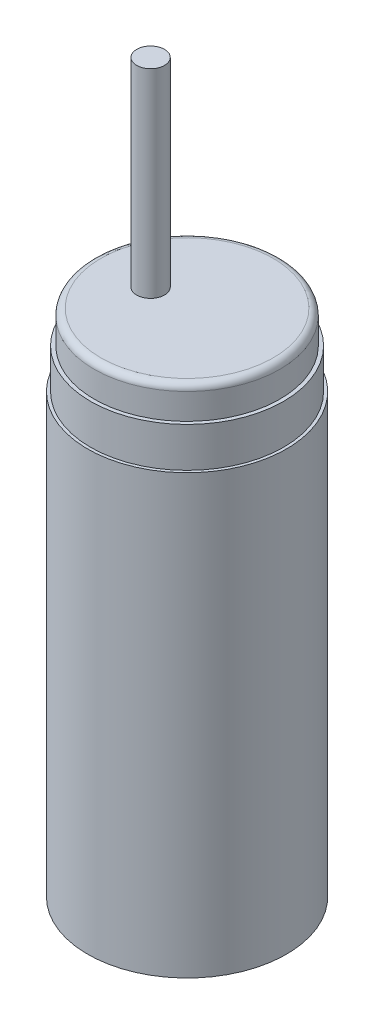
ISO-10303-21;
HEADER;
FILE_DESCRIPTION(('STEP AP214'),'2;1');
FILE_NAME('part.step','',(''),(''),'','','');
FILE_SCHEMA(('AUTOMOTIVE_DESIGN { 1 0 10303 214 1 1 1 1 }'));
ENDSEC;
DATA;
#1=APPLICATION_CONTEXT('core data for automotive mechanical design processes');
#2=APPLICATION_PROTOCOL_DEFINITION('international standard','automotive_design',2000,#1);
#3=PRODUCT_CONTEXT('',#1,'mechanical');
#4=PRODUCT('Part','Part','',(#3));
#5=PRODUCT_RELATED_PRODUCT_CATEGORY('part','',(#4));
#6=PRODUCT_DEFINITION_FORMATION('','',#4);
#7=PRODUCT_DEFINITION_CONTEXT('part definition',#1,'design');
#8=PRODUCT_DEFINITION('design','',#6,#7);
#9=PRODUCT_DEFINITION_SHAPE('','',#8);
#10=(LENGTH_UNIT() NAMED_UNIT(*) SI_UNIT(.MILLI.,.METRE.));
#11=(NAMED_UNIT(*) PLANE_ANGLE_UNIT() SI_UNIT($,.RADIAN.));
#12=(NAMED_UNIT(*) SI_UNIT($,.STERADIAN.) SOLID_ANGLE_UNIT());
#13=UNCERTAINTY_MEASURE_WITH_UNIT(LENGTH_MEASURE(1.E-05),#10,'distance_accuracy_value','');
#14=(GEOMETRIC_REPRESENTATION_CONTEXT(3) GLOBAL_UNCERTAINTY_ASSIGNED_CONTEXT((#13)) GLOBAL_UNIT_ASSIGNED_CONTEXT((#10,
#11,#12)) REPRESENTATION_CONTEXT('',''));
#15=CARTESIAN_POINT('',(0.,0.,0.));
#16=DIRECTION('',(0.,0.,1.));
#17=DIRECTION('',(1.,0.,0.));
#18=AXIS2_PLACEMENT_3D('',#15,#16,#17);
#19=CARTESIAN_POINT('',(0.,0.,0.));
#20=DIRECTION('',(0.,1.,0.));
#21=DIRECTION('',(1.,0.,0.));
#22=AXIS2_PLACEMENT_3D('',#19,#20,#21);
#23=PLANE('',#22);
#24=CARTESIAN_POINT('',(0.,0.,0.));
#25=DIRECTION('',(0.,-1.,0.));
#26=DIRECTION('',(1.,0.,0.));
#27=AXIS2_PLACEMENT_3D('',#24,#25,#26);
#28=CIRCLE('',#27,15.);
#29=CARTESIAN_POINT('',(-15.,0.,0.));
#30=VERTEX_POINT('',#29);
#31=EDGE_CURVE('E11',#30,#30,#28,.T.);
#32=ORIENTED_EDGE('',*,*,#31,.T.);
#33=EDGE_LOOP('',(#32));
#34=FACE_BOUND('',#33,.T.);
#35=CARTESIAN_POINT('',(0.,0.,0.));
#36=DIRECTION('',(0.,-1.,0.));
#37=DIRECTION('',(1.,0.,0.));
#38=AXIS2_PLACEMENT_3D('',#35,#36,#37);
#39=CIRCLE('',#38,14.);
#40=CARTESIAN_POINT('',(14.,0.,0.));
#41=VERTEX_POINT('',#40);
#42=EDGE_CURVE('E84',#41,#41,#39,.T.);
#43=ORIENTED_EDGE('',*,*,#42,.F.);
#44=EDGE_LOOP('',(#43));
#45=FACE_BOUND('',#44,.T.);
#46=ADVANCED_FACE('F17',(#34,#45),#23,.F.);
#47=CARTESIAN_POINT('',(0.,-3.6,0.));
#48=DIRECTION('',(0.,1.,0.));
#49=DIRECTION('',(1.,0.,0.));
#50=AXIS2_PLACEMENT_3D('',#47,#48,#49);
#51=CYLINDRICAL_SURFACE('',#50,15.);
#52=CARTESIAN_POINT('',(0.,66.,0.));
#53=DIRECTION('',(0.,1.,0.));
#54=DIRECTION('',(1.,0.,0.));
#55=AXIS2_PLACEMENT_3D('',#52,#53,#54);
#56=CIRCLE('',#55,15.);
#57=CARTESIAN_POINT('',(-15.,66.,0.));
#58=VERTEX_POINT('',#57);
#59=EDGE_CURVE('E28',#58,#58,#56,.T.);
#60=ORIENTED_EDGE('',*,*,#59,.F.);
#61=EDGE_LOOP('',(#60));
#62=FACE_BOUND('',#61,.T.);
#63=ORIENTED_EDGE('',*,*,#31,.F.);
#64=EDGE_LOOP('',(#63));
#65=FACE_BOUND('',#64,.T.);
#66=ADVANCED_FACE('F129',(#62,#65),#51,.T.);
#67=CARTESIAN_POINT('',(0.,66.,0.));
#68=DIRECTION('',(0.,1.,0.));
#69=DIRECTION('',(1.,0.,0.));
#70=AXIS2_PLACEMENT_3D('',#67,#68,#69);
#71=PLANE('',#70);
#72=ORIENTED_EDGE('',*,*,#59,.T.);
#73=EDGE_LOOP('',(#72));
#74=FACE_BOUND('',#73,.T.);
#75=CARTESIAN_POINT('',(0.,66.,0.));
#76=DIRECTION('',(0.,1.,0.));
#77=DIRECTION('',(1.,0.,0.));
#78=AXIS2_PLACEMENT_3D('',#75,#76,#77);
#79=CIRCLE('',#78,14.5625);
#80=CARTESIAN_POINT('',(-14.5625,66.,0.));
#81=VERTEX_POINT('',#80);
#82=EDGE_CURVE('E95',#81,#81,#79,.T.);
#83=ORIENTED_EDGE('',*,*,#82,.F.);
#84=EDGE_LOOP('',(#83));
#85=FACE_BOUND('',#84,.T.);
#86=ADVANCED_FACE('F127',(#74,#85),#71,.T.);
#87=CARTESIAN_POINT('',(0.,-3.6,0.));
#88=DIRECTION('',(0.,1.,0.));
#89=DIRECTION('',(1.,0.,0.));
#90=AXIS2_PLACEMENT_3D('',#87,#88,#89);
#91=CYLINDRICAL_SURFACE('',#90,14.5625);
#92=ORIENTED_EDGE('',*,*,#82,.T.);
#93=EDGE_LOOP('',(#92));
#94=FACE_BOUND('',#93,.T.);
#95=CARTESIAN_POINT('',(0.,72.,0.));
#96=DIRECTION('',(0.,1.,0.));
#97=DIRECTION('',(1.,0.,0.));
#98=AXIS2_PLACEMENT_3D('',#95,#96,#97);
#99=CIRCLE('',#98,14.5625);
#100=CARTESIAN_POINT('',(14.5625,72.,0.));
#101=VERTEX_POINT('',#100);
#102=EDGE_CURVE('E98',#101,#101,#99,.T.);
#103=ORIENTED_EDGE('',*,*,#102,.F.);
#104=EDGE_LOOP('',(#103));
#105=FACE_BOUND('',#104,.T.);
#106=ADVANCED_FACE('F123',(#94,#105),#91,.T.);
#107=CARTESIAN_POINT('',(0.,72.,0.));
#108=DIRECTION('',(0.,1.,0.));
#109=DIRECTION('',(1.,0.,0.));
#110=AXIS2_PLACEMENT_3D('',#107,#108,#109);
#111=PLANE('',#110);
#112=ORIENTED_EDGE('',*,*,#102,.T.);
#113=EDGE_LOOP('',(#112));
#114=FACE_BOUND('',#113,.T.);
#115=CARTESIAN_POINT('',(0.,72.,0.));
#116=DIRECTION('',(0.,1.,0.));
#117=DIRECTION('',(0.,0.,-1.));
#118=AXIS2_PLACEMENT_3D('',#115,#116,#117);
#119=CIRCLE('',#118,14.);
#120=CARTESIAN_POINT('',(0.,72.,-14.));
#121=VERTEX_POINT('',#120);
#122=EDGE_CURVE('E102',#121,#121,#119,.T.);
#123=ORIENTED_EDGE('',*,*,#122,.F.);
#124=EDGE_LOOP('',(#123));
#125=FACE_BOUND('',#124,.T.);
#126=ADVANCED_FACE('F136',(#114,#125),#111,.T.);
#127=CARTESIAN_POINT('',(0.,72.,0.));
#128=DIRECTION('',(0.,1.,0.));
#129=DIRECTION('',(0.,0.,-1.));
#130=AXIS2_PLACEMENT_3D('',#127,#128,#129);
#131=CYLINDRICAL_SURFACE('',#130,14.);
#132=CARTESIAN_POINT('',(0.,75.9,0.));
#133=DIRECTION('',(0.,1.,0.));
#134=DIRECTION('',(0.,0.,-1.));
#135=AXIS2_PLACEMENT_3D('',#132,#133,#134);
#136=CIRCLE('',#135,14.);
#137=CARTESIAN_POINT('',(0.,75.9,14.));
#138=VERTEX_POINT('',#137);
#139=EDGE_CURVE('E52',#138,#138,#136,.T.);
#140=ORIENTED_EDGE('',*,*,#139,.F.);
#141=EDGE_LOOP('',(#140));
#142=FACE_BOUND('',#141,.T.);
#143=ORIENTED_EDGE('',*,*,#122,.T.);
#144=EDGE_LOOP('',(#143));
#145=FACE_BOUND('',#144,.T.);
#146=ADVANCED_FACE('F149',(#142,#145),#131,.T.);
#147=CARTESIAN_POINT('',(0.,75.9,0.));
#148=DIRECTION('',(0.,1.,0.));
#149=DIRECTION('',(0.00972291912957834,0.,-0.999952731304635));
#150=AXIS2_PLACEMENT_3D('',#147,#148,#149);
#151=TOROIDAL_SURFACE('',#150,13.,1.);
#152=CARTESIAN_POINT('',(0.,76.9,0.));
#153=DIRECTION('',(0.,1.,0.));
#154=DIRECTION('',(0.,0.,-1.));
#155=AXIS2_PLACEMENT_3D('',#152,#153,#154);
#156=CIRCLE('',#155,13.);
#157=CARTESIAN_POINT('',(0.,76.9,13.));
#158=VERTEX_POINT('',#157);
#159=EDGE_CURVE('E64',#158,#158,#156,.T.);
#160=ORIENTED_EDGE('',*,*,#159,.F.);
#161=EDGE_LOOP('',(#160));
#162=FACE_BOUND('',#161,.T.);
#163=ORIENTED_EDGE('',*,*,#139,.T.);
#164=EDGE_LOOP('',(#163));
#165=FACE_BOUND('',#164,.T.);
#166=ADVANCED_FACE('F147',(#162,#165),#151,.T.);
#167=CARTESIAN_POINT('',(0.,76.9,0.));
#168=DIRECTION('',(0.,1.,0.));
#169=DIRECTION('',(1.,0.,0.));
#170=AXIS2_PLACEMENT_3D('',#167,#168,#169);
#171=PLANE('',#170);
#172=ORIENTED_EDGE('',*,*,#159,.T.);
#173=EDGE_LOOP('',(#172));
#174=FACE_BOUND('',#173,.T.);
#175=CARTESIAN_POINT('',(-5.5,76.9,0.));
#176=DIRECTION('',(0.,1.,0.));
#177=DIRECTION('',(1.,0.,0.));
#178=AXIS2_PLACEMENT_3D('',#175,#176,#177);
#179=CIRCLE('',#178,2.1);
#180=CARTESIAN_POINT('',(-3.4,76.9,0.));
#181=VERTEX_POINT('',#180);
#182=EDGE_CURVE('E83',#181,#181,#179,.T.);
#183=ORIENTED_EDGE('',*,*,#182,.F.);
#184=EDGE_LOOP('',(#183));
#185=FACE_BOUND('',#184,.T.);
#186=ADVANCED_FACE('F19',(#174,#185),#171,.T.);
#187=CARTESIAN_POINT('',(-5.5,76.9,0.));
#188=DIRECTION('',(0.,1.,0.));
#189=DIRECTION('',(1.,0.,0.));
#190=AXIS2_PLACEMENT_3D('',#187,#188,#189);
#191=CYLINDRICAL_SURFACE('',#190,2.1);
#192=ORIENTED_EDGE('',*,*,#182,.T.);
#193=EDGE_LOOP('',(#192));
#194=FACE_BOUND('',#193,.T.);
#195=CARTESIAN_POINT('',(-5.5,106.9,0.));
#196=DIRECTION('',(0.,1.,0.));
#197=DIRECTION('',(1.,0.,0.));
#198=AXIS2_PLACEMENT_3D('',#195,#196,#197);
#199=CIRCLE('',#198,2.1);
#200=CARTESIAN_POINT('',(-3.4,106.9,0.));
#201=VERTEX_POINT('',#200);
#202=EDGE_CURVE('E79',#201,#201,#199,.T.);
#203=ORIENTED_EDGE('',*,*,#202,.F.);
#204=EDGE_LOOP('',(#203));
#205=FACE_BOUND('',#204,.T.);
#206=ADVANCED_FACE('F80',(#194,#205),#191,.T.);
#207=CARTESIAN_POINT('',(0.,106.9,0.));
#208=DIRECTION('',(0.,1.,0.));
#209=DIRECTION('',(1.,0.,0.));
#210=AXIS2_PLACEMENT_3D('',#207,#208,#209);
#211=PLANE('',#210);
#212=ORIENTED_EDGE('',*,*,#202,.T.);
#213=EDGE_LOOP('',(#212));
#214=FACE_BOUND('',#213,.T.);
#215=ADVANCED_FACE('F154',(#214),#211,.T.);
#216=CARTESIAN_POINT('',(0.,0.,0.));
#217=DIRECTION('',(0.,-1.,0.));
#218=DIRECTION('',(0.999957179021973,0.,-0.00925419485517075));
#219=AXIS2_PLACEMENT_3D('',#216,#217,#218);
#220=TOROIDAL_SURFACE('',#219,13.2,0.8);
#221=CARTESIAN_POINT('',(0.,-0.8,0.));
#222=DIRECTION('',(0.,-1.,0.));
#223=DIRECTION('',(1.,0.,0.));
#224=AXIS2_PLACEMENT_3D('',#221,#222,#223);
#225=CIRCLE('',#224,13.2);
#226=CARTESIAN_POINT('',(-13.2,-0.8,0.));
#227=VERTEX_POINT('',#226);
#228=EDGE_CURVE('E21',#227,#227,#225,.T.);
#229=ORIENTED_EDGE('',*,*,#228,.F.);
#230=EDGE_LOOP('',(#229));
#231=FACE_BOUND('',#230,.T.);
#232=ORIENTED_EDGE('',*,*,#42,.T.);
#233=EDGE_LOOP('',(#232));
#234=FACE_BOUND('',#233,.T.);
#235=ADVANCED_FACE('F151',(#231,#234),#220,.T.);
#236=CARTESIAN_POINT('',(0.,-0.8,0.));
#237=DIRECTION('',(0.,-1.,0.));
#238=DIRECTION('',(0.,0.,-1.));
#239=AXIS2_PLACEMENT_3D('',#236,#237,#238);
#240=PLANE('',#239);
#241=ORIENTED_EDGE('',*,*,#228,.T.);
#242=EDGE_LOOP('',(#241));
#243=FACE_BOUND('',#242,.T.);
#244=ADVANCED_FACE('F153',(#243),#240,.T.);
#245=CLOSED_SHELL('',(#46,#66,#86,#106,#126,#146,#166,#186,#206,#215,#235,#244));
#246=MANIFOLD_SOLID_BREP('B1',#245);
#247=ADVANCED_BREP_SHAPE_REPRESENTATION('',(#18,#246),#14);
#248=SHAPE_DEFINITION_REPRESENTATION(#9,#247);
ENDSEC;
END-ISO-10303-21;
